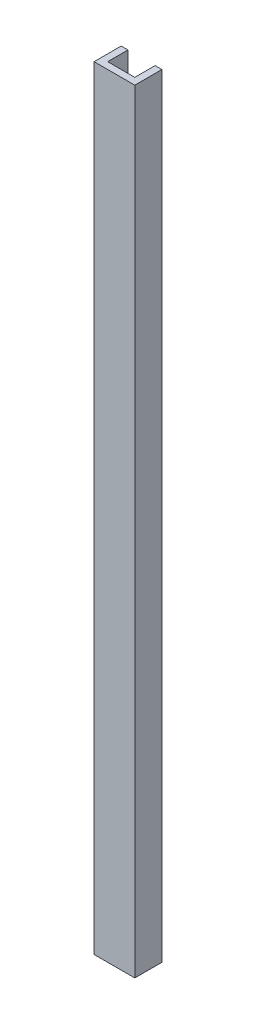
ISO-10303-21;
HEADER;
FILE_DESCRIPTION(('STEP AP214'),'2;1');
FILE_NAME('part.step','',(''),(''),'','','');
FILE_SCHEMA(('AUTOMOTIVE_DESIGN { 1 0 10303 214 1 1 1 1 }'));
ENDSEC;
DATA;
#1=APPLICATION_CONTEXT('core data for automotive mechanical design processes');
#2=APPLICATION_PROTOCOL_DEFINITION('international standard','automotive_design',2000,#1);
#3=PRODUCT_CONTEXT('',#1,'mechanical');
#4=PRODUCT('Part','Part','',(#3));
#5=PRODUCT_RELATED_PRODUCT_CATEGORY('part','',(#4));
#6=PRODUCT_DEFINITION_FORMATION('','',#4);
#7=PRODUCT_DEFINITION_CONTEXT('part definition',#1,'design');
#8=PRODUCT_DEFINITION('design','',#6,#7);
#9=PRODUCT_DEFINITION_SHAPE('','',#8);
#10=(LENGTH_UNIT() NAMED_UNIT(*) SI_UNIT(.MILLI.,.METRE.));
#11=(NAMED_UNIT(*) PLANE_ANGLE_UNIT() SI_UNIT($,.RADIAN.));
#12=(NAMED_UNIT(*) SI_UNIT($,.STERADIAN.) SOLID_ANGLE_UNIT());
#13=UNCERTAINTY_MEASURE_WITH_UNIT(LENGTH_MEASURE(1.E-05),#10,'distance_accuracy_value','');
#14=(GEOMETRIC_REPRESENTATION_CONTEXT(3) GLOBAL_UNCERTAINTY_ASSIGNED_CONTEXT((#13)) GLOBAL_UNIT_ASSIGNED_CONTEXT((#10,
#11,#12)) REPRESENTATION_CONTEXT('',''));
#15=CARTESIAN_POINT('',(0.,0.,0.));
#16=DIRECTION('',(0.,0.,1.));
#17=DIRECTION('',(1.,0.,0.));
#18=AXIS2_PLACEMENT_3D('',#15,#16,#17);
#19=CARTESIAN_POINT('',(19.05,361.95,0.));
#20=DIRECTION('',(-1.,0.,0.));
#21=DIRECTION('',(0.,0.,1.));
#22=AXIS2_PLACEMENT_3D('',#19,#20,#21);
#23=PLANE('',#22);
#24=DIRECTION('',(0.,0.,-1.));
#25=VECTOR('',#24,1.);
#26=CARTESIAN_POINT('',(19.05,0.,0.));
#27=LINE('',#26,#25);
#28=CARTESIAN_POINT('',(19.05,0.,0.));
#29=VERTEX_POINT('',#28);
#30=CARTESIAN_POINT('',(19.05,0.,-12.7));
#31=VERTEX_POINT('',#30);
#32=EDGE_CURVE('E130',#29,#31,#27,.T.);
#33=ORIENTED_EDGE('',*,*,#32,.T.);
#34=DIRECTION('',(0.,-1.,0.));
#35=VECTOR('',#34,1.);
#36=CARTESIAN_POINT('',(19.05,361.95,-12.7));
#37=LINE('',#36,#35);
#38=CARTESIAN_POINT('',(19.05,361.95,-12.7));
#39=VERTEX_POINT('',#38);
#40=EDGE_CURVE('E11',#39,#31,#37,.T.);
#41=ORIENTED_EDGE('',*,*,#40,.F.);
#42=DIRECTION('',(0.,0.,-1.));
#43=VECTOR('',#42,1.);
#44=CARTESIAN_POINT('',(19.05,361.95,0.));
#45=LINE('',#44,#43);
#46=CARTESIAN_POINT('',(19.05,361.95,0.));
#47=VERTEX_POINT('',#46);
#48=EDGE_CURVE('E88',#47,#39,#45,.T.);
#49=ORIENTED_EDGE('',*,*,#48,.F.);
#50=DIRECTION('',(0.,-1.,0.));
#51=VECTOR('',#50,1.);
#52=CARTESIAN_POINT('',(19.05,361.95,0.));
#53=LINE('',#52,#51);
#54=EDGE_CURVE('E129',#47,#29,#53,.T.);
#55=ORIENTED_EDGE('',*,*,#54,.T.);
#56=EDGE_LOOP('',(#33,#41,#49,#55));
#57=FACE_BOUND('',#56,.T.);
#58=ADVANCED_FACE('F33',(#57),#23,.F.);
#59=CARTESIAN_POINT('',(15.875,361.95,-12.7));
#60=DIRECTION('',(0.,0.,-1.));
#61=DIRECTION('',(-1.,0.,0.));
#62=AXIS2_PLACEMENT_3D('',#59,#60,#61);
#63=PLANE('',#62);
#64=DIRECTION('',(1.,0.,0.));
#65=VECTOR('',#64,1.);
#66=CARTESIAN_POINT('',(15.875,0.,-12.7));
#67=LINE('',#66,#65);
#68=CARTESIAN_POINT('',(15.875,0.,-12.7));
#69=VERTEX_POINT('',#68);
#70=EDGE_CURVE('E133',#69,#31,#67,.T.);
#71=ORIENTED_EDGE('',*,*,#70,.F.);
#72=DIRECTION('',(0.,-1.,0.));
#73=VECTOR('',#72,1.);
#74=CARTESIAN_POINT('',(15.875,361.95,-12.7));
#75=LINE('',#74,#73);
#76=CARTESIAN_POINT('',(15.875,361.95,-12.7));
#77=VERTEX_POINT('',#76);
#78=EDGE_CURVE('E41',#77,#69,#75,.T.);
#79=ORIENTED_EDGE('',*,*,#78,.F.);
#80=DIRECTION('',(1.,0.,0.));
#81=VECTOR('',#80,1.);
#82=CARTESIAN_POINT('',(15.875,361.95,-12.7));
#83=LINE('',#82,#81);
#84=EDGE_CURVE('E172',#77,#39,#83,.T.);
#85=ORIENTED_EDGE('',*,*,#84,.T.);
#86=ORIENTED_EDGE('',*,*,#40,.T.);
#87=EDGE_LOOP('',(#71,#79,#85,#86));
#88=FACE_BOUND('',#87,.T.);
#89=ADVANCED_FACE('F163',(#88),#63,.T.);
#90=CARTESIAN_POINT('',(15.875,361.95,0.));
#91=DIRECTION('',(-1.,0.,0.));
#92=DIRECTION('',(0.,0.,1.));
#93=AXIS2_PLACEMENT_3D('',#90,#91,#92);
#94=PLANE('',#93);
#95=DIRECTION('',(0.,0.,-1.));
#96=VECTOR('',#95,1.);
#97=CARTESIAN_POINT('',(15.875,0.,0.));
#98=LINE('',#97,#96);
#99=CARTESIAN_POINT('',(15.875,0.,-3.175));
#100=VERTEX_POINT('',#99);
#101=EDGE_CURVE('E136',#100,#69,#98,.T.);
#102=ORIENTED_EDGE('',*,*,#101,.F.);
#103=DIRECTION('',(0.,-1.,0.));
#104=VECTOR('',#103,1.);
#105=CARTESIAN_POINT('',(15.875,361.95,-3.175));
#106=LINE('',#105,#104);
#107=CARTESIAN_POINT('',(15.875,361.95,-3.175));
#108=VERTEX_POINT('',#107);
#109=EDGE_CURVE('E153',#108,#100,#106,.T.);
#110=ORIENTED_EDGE('',*,*,#109,.F.);
#111=DIRECTION('',(0.,0.,-1.));
#112=VECTOR('',#111,1.);
#113=CARTESIAN_POINT('',(15.875,361.95,0.));
#114=LINE('',#113,#112);
#115=EDGE_CURVE('E160',#108,#77,#114,.T.);
#116=ORIENTED_EDGE('',*,*,#115,.T.);
#117=ORIENTED_EDGE('',*,*,#78,.T.);
#118=EDGE_LOOP('',(#102,#110,#116,#117));
#119=FACE_BOUND('',#118,.T.);
#120=ADVANCED_FACE('F158',(#119),#94,.T.);
#121=CARTESIAN_POINT('',(0.,361.95,-3.175));
#122=DIRECTION('',(0.,0.,-1.));
#123=DIRECTION('',(-1.,0.,0.));
#124=AXIS2_PLACEMENT_3D('',#121,#122,#123);
#125=PLANE('',#124);
#126=DIRECTION('',(1.,0.,0.));
#127=VECTOR('',#126,1.);
#128=CARTESIAN_POINT('',(0.,0.,-3.175));
#129=LINE('',#128,#127);
#130=CARTESIAN_POINT('',(3.175,0.,-3.175));
#131=VERTEX_POINT('',#130);
#132=EDGE_CURVE('E139',#131,#100,#129,.T.);
#133=ORIENTED_EDGE('',*,*,#132,.F.);
#134=DIRECTION('',(0.,-1.,0.));
#135=VECTOR('',#134,1.);
#136=CARTESIAN_POINT('',(3.175,361.95,-3.175));
#137=LINE('',#136,#135);
#138=CARTESIAN_POINT('',(3.175,361.95,-3.175));
#139=VERTEX_POINT('',#138);
#140=EDGE_CURVE('E151',#139,#131,#137,.T.);
#141=ORIENTED_EDGE('',*,*,#140,.F.);
#142=DIRECTION('',(1.,0.,0.));
#143=VECTOR('',#142,1.);
#144=CARTESIAN_POINT('',(0.,361.95,-3.175));
#145=LINE('',#144,#143);
#146=EDGE_CURVE('E124',#139,#108,#145,.T.);
#147=ORIENTED_EDGE('',*,*,#146,.T.);
#148=ORIENTED_EDGE('',*,*,#109,.T.);
#149=EDGE_LOOP('',(#133,#141,#147,#148));
#150=FACE_BOUND('',#149,.T.);
#151=ADVANCED_FACE('F170',(#150),#125,.T.);
#152=CARTESIAN_POINT('',(3.175,361.95,-12.7));
#153=DIRECTION('',(1.,0.,0.));
#154=DIRECTION('',(0.,0.,-1.));
#155=AXIS2_PLACEMENT_3D('',#152,#153,#154);
#156=PLANE('',#155);
#157=DIRECTION('',(0.,0.,1.));
#158=VECTOR('',#157,1.);
#159=CARTESIAN_POINT('',(3.175,0.,-12.7));
#160=LINE('',#159,#158);
#161=CARTESIAN_POINT('',(3.175,0.,-12.7));
#162=VERTEX_POINT('',#161);
#163=EDGE_CURVE('E142',#162,#131,#160,.T.);
#164=ORIENTED_EDGE('',*,*,#163,.F.);
#165=DIRECTION('',(0.,-1.,0.));
#166=VECTOR('',#165,1.);
#167=CARTESIAN_POINT('',(3.175,361.95,-12.7));
#168=LINE('',#167,#166);
#169=CARTESIAN_POINT('',(3.175,361.95,-12.7));
#170=VERTEX_POINT('',#169);
#171=EDGE_CURVE('E112',#170,#162,#168,.T.);
#172=ORIENTED_EDGE('',*,*,#171,.F.);
#173=DIRECTION('',(0.,0.,1.));
#174=VECTOR('',#173,1.);
#175=CARTESIAN_POINT('',(3.175,361.95,-12.7));
#176=LINE('',#175,#174);
#177=EDGE_CURVE('E122',#170,#139,#176,.T.);
#178=ORIENTED_EDGE('',*,*,#177,.T.);
#179=ORIENTED_EDGE('',*,*,#140,.T.);
#180=EDGE_LOOP('',(#164,#172,#178,#179));
#181=FACE_BOUND('',#180,.T.);
#182=ADVANCED_FACE('F177',(#181),#156,.T.);
#183=CARTESIAN_POINT('',(0.,361.95,-12.7));
#184=DIRECTION('',(0.,0.,-1.));
#185=DIRECTION('',(-1.,0.,0.));
#186=AXIS2_PLACEMENT_3D('',#183,#184,#185);
#187=PLANE('',#186);
#188=DIRECTION('',(1.,0.,0.));
#189=VECTOR('',#188,1.);
#190=CARTESIAN_POINT('',(0.,0.,-12.7));
#191=LINE('',#190,#189);
#192=CARTESIAN_POINT('',(0.,0.,-12.7));
#193=VERTEX_POINT('',#192);
#194=EDGE_CURVE('E111',#193,#162,#191,.T.);
#195=ORIENTED_EDGE('',*,*,#194,.F.);
#196=DIRECTION('',(0.,-1.,0.));
#197=VECTOR('',#196,1.);
#198=CARTESIAN_POINT('',(0.,361.95,-12.7));
#199=LINE('',#198,#197);
#200=CARTESIAN_POINT('',(0.,361.95,-12.7));
#201=VERTEX_POINT('',#200);
#202=EDGE_CURVE('E105',#201,#193,#199,.T.);
#203=ORIENTED_EDGE('',*,*,#202,.F.);
#204=DIRECTION('',(1.,0.,0.));
#205=VECTOR('',#204,1.);
#206=CARTESIAN_POINT('',(0.,361.95,-12.7));
#207=LINE('',#206,#205);
#208=EDGE_CURVE('E109',#201,#170,#207,.T.);
#209=ORIENTED_EDGE('',*,*,#208,.T.);
#210=ORIENTED_EDGE('',*,*,#171,.T.);
#211=EDGE_LOOP('',(#195,#203,#209,#210));
#212=FACE_BOUND('',#211,.T.);
#213=ADVANCED_FACE('F107',(#212),#187,.T.);
#214=CARTESIAN_POINT('',(0.,361.95,-12.7));
#215=DIRECTION('',(1.,0.,0.));
#216=DIRECTION('',(0.,0.,-1.));
#217=AXIS2_PLACEMENT_3D('',#214,#215,#216);
#218=PLANE('',#217);
#219=DIRECTION('',(0.,0.,1.));
#220=VECTOR('',#219,1.);
#221=CARTESIAN_POINT('',(0.,0.,-12.7));
#222=LINE('',#221,#220);
#223=CARTESIAN_POINT('',(0.,0.,0.));
#224=VERTEX_POINT('',#223);
#225=EDGE_CURVE('E76',#193,#224,#222,.T.);
#226=ORIENTED_EDGE('',*,*,#225,.T.);
#227=DIRECTION('',(0.,-1.,0.));
#228=VECTOR('',#227,1.);
#229=CARTESIAN_POINT('',(0.,361.95,0.));
#230=LINE('',#229,#228);
#231=CARTESIAN_POINT('',(0.,361.95,0.));
#232=VERTEX_POINT('',#231);
#233=EDGE_CURVE('E113',#232,#224,#230,.T.);
#234=ORIENTED_EDGE('',*,*,#233,.F.);
#235=DIRECTION('',(0.,0.,1.));
#236=VECTOR('',#235,1.);
#237=CARTESIAN_POINT('',(0.,361.95,-12.7));
#238=LINE('',#237,#236);
#239=EDGE_CURVE('E115',#201,#232,#238,.T.);
#240=ORIENTED_EDGE('',*,*,#239,.F.);
#241=ORIENTED_EDGE('',*,*,#202,.T.);
#242=EDGE_LOOP('',(#226,#234,#240,#241));
#243=FACE_BOUND('',#242,.T.);
#244=ADVANCED_FACE('F116',(#243),#218,.F.);
#245=CARTESIAN_POINT('',(0.,361.95,0.));
#246=DIRECTION('',(0.,0.,-1.));
#247=DIRECTION('',(-1.,0.,0.));
#248=AXIS2_PLACEMENT_3D('',#245,#246,#247);
#249=PLANE('',#248);
#250=DIRECTION('',(1.,0.,0.));
#251=VECTOR('',#250,1.);
#252=CARTESIAN_POINT('',(0.,0.,0.));
#253=LINE('',#252,#251);
#254=EDGE_CURVE('E82',#224,#29,#253,.T.);
#255=ORIENTED_EDGE('',*,*,#254,.T.);
#256=ORIENTED_EDGE('',*,*,#54,.F.);
#257=DIRECTION('',(1.,0.,0.));
#258=VECTOR('',#257,1.);
#259=CARTESIAN_POINT('',(0.,361.95,0.));
#260=LINE('',#259,#258);
#261=EDGE_CURVE('E49',#232,#47,#260,.T.);
#262=ORIENTED_EDGE('',*,*,#261,.F.);
#263=ORIENTED_EDGE('',*,*,#233,.T.);
#264=EDGE_LOOP('',(#255,#256,#262,#263));
#265=FACE_BOUND('',#264,.T.);
#266=ADVANCED_FACE('F179',(#265),#249,.F.);
#267=CARTESIAN_POINT('',(0.,361.95,0.));
#268=DIRECTION('',(0.,-1.,0.));
#269=DIRECTION('',(-1.,0.,0.));
#270=AXIS2_PLACEMENT_3D('',#267,#268,#269);
#271=PLANE('',#270);
#272=ORIENTED_EDGE('',*,*,#48,.T.);
#273=ORIENTED_EDGE('',*,*,#84,.F.);
#274=ORIENTED_EDGE('',*,*,#115,.F.);
#275=ORIENTED_EDGE('',*,*,#146,.F.);
#276=ORIENTED_EDGE('',*,*,#177,.F.);
#277=ORIENTED_EDGE('',*,*,#208,.F.);
#278=ORIENTED_EDGE('',*,*,#239,.T.);
#279=ORIENTED_EDGE('',*,*,#261,.T.);
#280=EDGE_LOOP('',(#272,#273,#274,#275,#276,#277,#278,#279));
#281=FACE_BOUND('',#280,.T.);
#282=ADVANCED_FACE('F119',(#281),#271,.F.);
#283=CARTESIAN_POINT('',(0.,0.,0.));
#284=DIRECTION('',(0.,-1.,0.));
#285=DIRECTION('',(-1.,0.,0.));
#286=AXIS2_PLACEMENT_3D('',#283,#284,#285);
#287=PLANE('',#286);
#288=ORIENTED_EDGE('',*,*,#32,.F.);
#289=ORIENTED_EDGE('',*,*,#254,.F.);
#290=ORIENTED_EDGE('',*,*,#225,.F.);
#291=ORIENTED_EDGE('',*,*,#194,.T.);
#292=ORIENTED_EDGE('',*,*,#163,.T.);
#293=ORIENTED_EDGE('',*,*,#132,.T.);
#294=ORIENTED_EDGE('',*,*,#101,.T.);
#295=ORIENTED_EDGE('',*,*,#70,.T.);
#296=EDGE_LOOP('',(#288,#289,#290,#291,#292,#293,#294,#295));
#297=FACE_BOUND('',#296,.T.);
#298=ADVANCED_FACE('F166',(#297),#287,.T.);
#299=CLOSED_SHELL('',(#58,#89,#120,#151,#182,#213,#244,#266,#282,#298));
#300=MANIFOLD_SOLID_BREP('B2',#299);
#301=ADVANCED_BREP_SHAPE_REPRESENTATION('',(#18,#300),#14);
#302=SHAPE_DEFINITION_REPRESENTATION(#9,#301);
ENDSEC;
END-ISO-10303-21;
